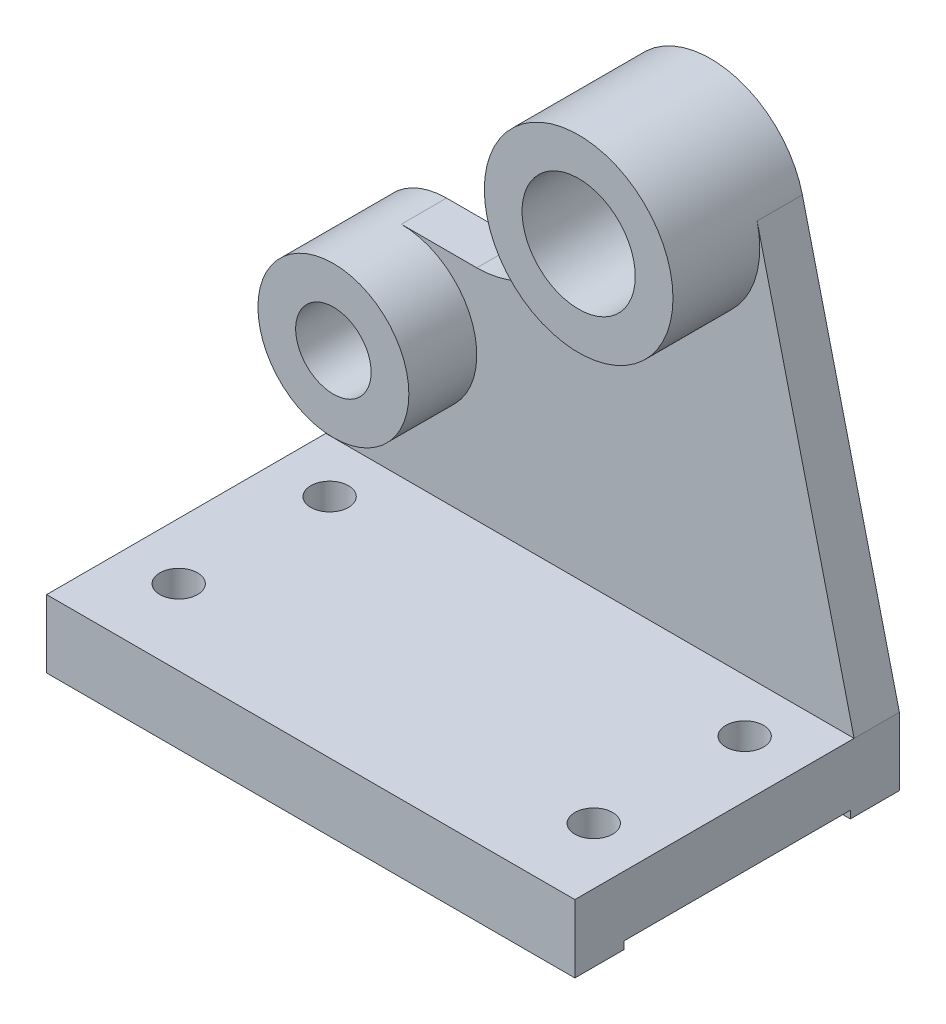
ISO-10303-21;
HEADER;
FILE_DESCRIPTION(('STEP AP214'),'2;1');
FILE_NAME('part.step','',(''),(''),'','','');
FILE_SCHEMA(('AUTOMOTIVE_DESIGN { 1 0 10303 214 1 1 1 1 }'));
ENDSEC;
DATA;
#1=APPLICATION_CONTEXT('core data for automotive mechanical design processes');
#2=APPLICATION_PROTOCOL_DEFINITION('international standard','automotive_design',2000,#1);
#3=PRODUCT_CONTEXT('',#1,'mechanical');
#4=PRODUCT('Part','Part','',(#3));
#5=PRODUCT_RELATED_PRODUCT_CATEGORY('part','',(#4));
#6=PRODUCT_DEFINITION_FORMATION('','',#4);
#7=PRODUCT_DEFINITION_CONTEXT('part definition',#1,'design');
#8=PRODUCT_DEFINITION('design','',#6,#7);
#9=PRODUCT_DEFINITION_SHAPE('','',#8);
#10=(LENGTH_UNIT() NAMED_UNIT(*) SI_UNIT(.MILLI.,.METRE.));
#11=(NAMED_UNIT(*) PLANE_ANGLE_UNIT() SI_UNIT($,.RADIAN.));
#12=(NAMED_UNIT(*) SI_UNIT($,.STERADIAN.) SOLID_ANGLE_UNIT());
#13=UNCERTAINTY_MEASURE_WITH_UNIT(LENGTH_MEASURE(1.E-05),#10,'distance_accuracy_value','');
#14=(GEOMETRIC_REPRESENTATION_CONTEXT(3) GLOBAL_UNCERTAINTY_ASSIGNED_CONTEXT((#13)) GLOBAL_UNIT_ASSIGNED_CONTEXT((#10,
#11,#12)) REPRESENTATION_CONTEXT('',''));
#15=CARTESIAN_POINT('',(0.,0.,0.));
#16=DIRECTION('',(0.,0.,1.));
#17=DIRECTION('',(1.,0.,0.));
#18=AXIS2_PLACEMENT_3D('',#15,#16,#17);
#19=CARTESIAN_POINT('',(0.,-9.,86.));
#20=DIRECTION('',(0.,1.,0.));
#21=DIRECTION('',(0.,0.,1.));
#22=AXIS2_PLACEMENT_3D('',#19,#20,#21);
#23=PLANE('',#22);
#24=DIRECTION('',(0.,0.,-1.));
#25=VECTOR('',#24,1.);
#26=CARTESIAN_POINT('',(-70.,-9.,86.));
#27=LINE('',#26,#25);
#28=CARTESIAN_POINT('',(-70.,-9.,86.));
#29=VERTEX_POINT('',#28);
#30=CARTESIAN_POINT('',(-70.,-9.,73.));
#31=VERTEX_POINT('',#30);
#32=EDGE_CURVE('E271',#29,#31,#27,.T.);
#33=ORIENTED_EDGE('',*,*,#32,.T.);
#34=DIRECTION('',(1.,0.,0.));
#35=VECTOR('',#34,1.);
#36=CARTESIAN_POINT('',(0.,-9.,73.));
#37=LINE('',#36,#35);
#38=CARTESIAN_POINT('',(70.,-9.,73.));
#39=VERTEX_POINT('',#38);
#40=EDGE_CURVE('E11',#31,#39,#37,.T.);
#41=ORIENTED_EDGE('',*,*,#40,.T.);
#42=DIRECTION('',(0.,0.,-1.));
#43=VECTOR('',#42,1.);
#44=CARTESIAN_POINT('',(70.,-9.,86.));
#45=LINE('',#44,#43);
#46=CARTESIAN_POINT('',(70.,-9.,86.));
#47=VERTEX_POINT('',#46);
#48=EDGE_CURVE('E167',#47,#39,#45,.T.);
#49=ORIENTED_EDGE('',*,*,#48,.F.);
#50=DIRECTION('',(1.,0.,0.));
#51=VECTOR('',#50,1.);
#52=CARTESIAN_POINT('',(0.,-9.,86.));
#53=LINE('',#52,#51);
#54=EDGE_CURVE('E255',#29,#47,#53,.T.);
#55=ORIENTED_EDGE('',*,*,#54,.F.);
#56=EDGE_LOOP('',(#33,#41,#49,#55));
#57=FACE_BOUND('',#56,.T.);
#58=ADVANCED_FACE('F39',(#57),#23,.F.);
#59=CARTESIAN_POINT('',(70.,0.,86.));
#60=DIRECTION('',(-1.,0.,0.));
#61=DIRECTION('',(0.,0.,1.));
#62=AXIS2_PLACEMENT_3D('',#59,#60,#61);
#63=PLANE('',#62);
#64=DIRECTION('',(0.,-1.,0.));
#65=VECTOR('',#64,1.);
#66=CARTESIAN_POINT('',(70.,-7.,73.));
#67=LINE('',#66,#65);
#68=CARTESIAN_POINT('',(70.,-7.,73.));
#69=VERTEX_POINT('',#68);
#70=EDGE_CURVE('E172',#69,#39,#67,.T.);
#71=ORIENTED_EDGE('',*,*,#70,.F.);
#72=DIRECTION('',(0.,0.,1.));
#73=VECTOR('',#72,1.);
#74=CARTESIAN_POINT('',(70.,-6.99999999999999,13.));
#75=LINE('',#74,#73);
#76=CARTESIAN_POINT('',(70.,-6.99999999999999,13.));
#77=VERTEX_POINT('',#76);
#78=EDGE_CURVE('E177',#77,#69,#75,.T.);
#79=ORIENTED_EDGE('',*,*,#78,.F.);
#80=DIRECTION('',(0.,1.,0.));
#81=VECTOR('',#80,1.);
#82=CARTESIAN_POINT('',(70.,-6.99999999999999,13.));
#83=LINE('',#82,#81);
#84=CARTESIAN_POINT('',(70.,-9.,13.));
#85=VERTEX_POINT('',#84);
#86=EDGE_CURVE('E151',#85,#77,#83,.T.);
#87=ORIENTED_EDGE('',*,*,#86,.F.);
#88=CARTESIAN_POINT('',(70.,-9.,0.));
#89=VERTEX_POINT('',#88);
#90=EDGE_CURVE('E168',#85,#89,#45,.T.);
#91=ORIENTED_EDGE('',*,*,#90,.T.);
#92=DIRECTION('',(0.,1.,0.));
#93=VECTOR('',#92,1.);
#94=CARTESIAN_POINT('',(70.,0.,0.));
#95=LINE('',#94,#93);
#96=CARTESIAN_POINT('',(70.,9.,0.));
#97=VERTEX_POINT('',#96);
#98=EDGE_CURVE('E268',#89,#97,#95,.T.);
#99=ORIENTED_EDGE('',*,*,#98,.T.);
#100=DIRECTION('',(0.,0.,-1.));
#101=VECTOR('',#100,1.);
#102=CARTESIAN_POINT('',(70.,9.,12.));
#103=LINE('',#102,#101);
#104=CARTESIAN_POINT('',(70.,9.,12.));
#105=VERTEX_POINT('',#104);
#106=EDGE_CURVE('E238',#105,#97,#103,.T.);
#107=ORIENTED_EDGE('',*,*,#106,.F.);
#108=DIRECTION('',(0.,0.,-1.));
#109=VECTOR('',#108,1.);
#110=CARTESIAN_POINT('',(70.,9.,86.));
#111=LINE('',#110,#109);
#112=CARTESIAN_POINT('',(70.,9.,86.));
#113=VERTEX_POINT('',#112);
#114=EDGE_CURVE('E277',#113,#105,#111,.T.);
#115=ORIENTED_EDGE('',*,*,#114,.F.);
#116=DIRECTION('',(0.,1.,0.));
#117=VECTOR('',#116,1.);
#118=CARTESIAN_POINT('',(70.,0.,86.));
#119=LINE('',#118,#117);
#120=EDGE_CURVE('E260',#47,#113,#119,.T.);
#121=ORIENTED_EDGE('',*,*,#120,.F.);
#122=ORIENTED_EDGE('',*,*,#48,.T.);
#123=EDGE_LOOP('',(#71,#79,#87,#91,#99,#107,#115,#121,#122));
#124=FACE_BOUND('',#123,.T.);
#125=ADVANCED_FACE('F307',(#124),#63,.F.);
#126=CARTESIAN_POINT('',(-70.,0.,86.));
#127=DIRECTION('',(-1.,0.,0.));
#128=DIRECTION('',(0.,0.,1.));
#129=AXIS2_PLACEMENT_3D('',#126,#127,#128);
#130=PLANE('',#129);
#131=DIRECTION('',(0.,0.,1.));
#132=VECTOR('',#131,1.);
#133=CARTESIAN_POINT('',(-70.,-6.99999999999999,13.));
#134=LINE('',#133,#132);
#135=CARTESIAN_POINT('',(-70.,-6.99999999999999,13.));
#136=VERTEX_POINT('',#135);
#137=CARTESIAN_POINT('',(-70.,-7.,73.));
#138=VERTEX_POINT('',#137);
#139=EDGE_CURVE('E156',#136,#138,#134,.T.);
#140=ORIENTED_EDGE('',*,*,#139,.T.);
#141=DIRECTION('',(0.,-1.,0.));
#142=VECTOR('',#141,1.);
#143=CARTESIAN_POINT('',(-70.,-7.,73.));
#144=LINE('',#143,#142);
#145=EDGE_CURVE('E57',#138,#31,#144,.T.);
#146=ORIENTED_EDGE('',*,*,#145,.T.);
#147=ORIENTED_EDGE('',*,*,#32,.F.);
#148=DIRECTION('',(0.,1.,0.));
#149=VECTOR('',#148,1.);
#150=CARTESIAN_POINT('',(-70.,0.,86.));
#151=LINE('',#150,#149);
#152=CARTESIAN_POINT('',(-70.,9.,86.));
#153=VERTEX_POINT('',#152);
#154=EDGE_CURVE('E263',#29,#153,#151,.T.);
#155=ORIENTED_EDGE('',*,*,#154,.T.);
#156=DIRECTION('',(0.,0.,-1.));
#157=VECTOR('',#156,1.);
#158=CARTESIAN_POINT('',(-70.,9.,86.));
#159=LINE('',#158,#157);
#160=CARTESIAN_POINT('',(-70.,9.,12.));
#161=VERTEX_POINT('',#160);
#162=EDGE_CURVE('E273',#153,#161,#159,.T.);
#163=ORIENTED_EDGE('',*,*,#162,.T.);
#164=DIRECTION('',(0.,1.,0.));
#165=VECTOR('',#164,1.);
#166=CARTESIAN_POINT('',(-70.,0.,12.));
#167=LINE('',#166,#165);
#168=CARTESIAN_POINT('',(-70.,47.,12.));
#169=VERTEX_POINT('',#168);
#170=EDGE_CURVE('E216',#161,#169,#167,.T.);
#171=ORIENTED_EDGE('',*,*,#170,.T.);
#172=DIRECTION('',(0.,0.,-1.));
#173=VECTOR('',#172,1.);
#174=CARTESIAN_POINT('',(-70.,47.,12.));
#175=LINE('',#174,#173);
#176=CARTESIAN_POINT('',(-70.,47.,0.));
#177=VERTEX_POINT('',#176);
#178=EDGE_CURVE('E245',#169,#177,#175,.T.);
#179=ORIENTED_EDGE('',*,*,#178,.T.);
#180=DIRECTION('',(0.,1.,0.));
#181=VECTOR('',#180,1.);
#182=CARTESIAN_POINT('',(-70.,0.,0.));
#183=LINE('',#182,#181);
#184=CARTESIAN_POINT('',(-70.,-9.,0.));
#185=VERTEX_POINT('',#184);
#186=EDGE_CURVE('E256',#185,#177,#183,.T.);
#187=ORIENTED_EDGE('',*,*,#186,.F.);
#188=CARTESIAN_POINT('',(-70.,-9.,13.));
#189=VERTEX_POINT('',#188);
#190=EDGE_CURVE('E164',#189,#185,#27,.T.);
#191=ORIENTED_EDGE('',*,*,#190,.F.);
#192=DIRECTION('',(0.,1.,0.));
#193=VECTOR('',#192,1.);
#194=CARTESIAN_POINT('',(-70.,-6.99999999999999,13.));
#195=LINE('',#194,#193);
#196=EDGE_CURVE('E146',#189,#136,#195,.T.);
#197=ORIENTED_EDGE('',*,*,#196,.T.);
#198=EDGE_LOOP('',(#140,#146,#147,#155,#163,#171,#179,#187,#191,#197));
#199=FACE_BOUND('',#198,.T.);
#200=ADVANCED_FACE('F162',(#199),#130,.T.);
#201=ORIENTED_EDGE('',*,*,#90,.F.);
#202=DIRECTION('',(-1.,0.,0.));
#203=VECTOR('',#202,1.);
#204=CARTESIAN_POINT('',(0.,-9.,13.));
#205=LINE('',#204,#203);
#206=EDGE_CURVE('E48',#85,#189,#205,.T.);
#207=ORIENTED_EDGE('',*,*,#206,.T.);
#208=ORIENTED_EDGE('',*,*,#190,.T.);
#209=DIRECTION('',(1.,0.,0.));
#210=VECTOR('',#209,1.);
#211=CARTESIAN_POINT('',(0.,-9.,0.));
#212=LINE('',#211,#210);
#213=EDGE_CURVE('E251',#185,#89,#212,.T.);
#214=ORIENTED_EDGE('',*,*,#213,.T.);
#215=EDGE_LOOP('',(#201,#207,#208,#214));
#216=FACE_BOUND('',#215,.T.);
#217=ADVANCED_FACE('F41',(#216),#23,.F.);
#218=CARTESIAN_POINT('',(0.,9.,86.));
#219=DIRECTION('',(0.,1.,0.));
#220=DIRECTION('',(0.,0.,1.));
#221=AXIS2_PLACEMENT_3D('',#218,#219,#220);
#222=PLANE('',#221);
#223=CARTESIAN_POINT('',(-55.0000000000002,9.,26.));
#224=DIRECTION('',(0.,1.,0.));
#225=DIRECTION('',(0.,0.,1.));
#226=AXIS2_PLACEMENT_3D('',#223,#224,#225);
#227=CIRCLE('',#226,5.);
#228=CARTESIAN_POINT('',(-55.0000000000002,9.,31.));
#229=VERTEX_POINT('',#228);
#230=EDGE_CURVE('E522',#229,#229,#227,.T.);
#231=ORIENTED_EDGE('',*,*,#230,.F.);
#232=EDGE_LOOP('',(#231));
#233=FACE_BOUND('',#232,.T.);
#234=CARTESIAN_POINT('',(54.9999999999998,9.,26.));
#235=DIRECTION('',(0.,1.,0.));
#236=DIRECTION('',(0.,0.,1.));
#237=AXIS2_PLACEMENT_3D('',#234,#235,#236);
#238=CIRCLE('',#237,5.);
#239=CARTESIAN_POINT('',(54.9999999999998,9.,31.));
#240=VERTEX_POINT('',#239);
#241=EDGE_CURVE('E516',#240,#240,#238,.T.);
#242=ORIENTED_EDGE('',*,*,#241,.F.);
#243=EDGE_LOOP('',(#242));
#244=FACE_BOUND('',#243,.T.);
#245=CARTESIAN_POINT('',(55.,9.,66.));
#246=DIRECTION('',(0.,1.,0.));
#247=DIRECTION('',(0.,0.,1.));
#248=AXIS2_PLACEMENT_3D('',#245,#246,#247);
#249=CIRCLE('',#248,5.);
#250=CARTESIAN_POINT('',(55.,9.,71.));
#251=VERTEX_POINT('',#250);
#252=EDGE_CURVE('E508',#251,#251,#249,.T.);
#253=ORIENTED_EDGE('',*,*,#252,.F.);
#254=EDGE_LOOP('',(#253));
#255=FACE_BOUND('',#254,.T.);
#256=CARTESIAN_POINT('',(-55.,9.,66.));
#257=DIRECTION('',(0.,1.,0.));
#258=DIRECTION('',(0.,0.,1.));
#259=AXIS2_PLACEMENT_3D('',#256,#257,#258);
#260=CIRCLE('',#259,5.);
#261=CARTESIAN_POINT('',(-55.,9.,71.));
#262=VERTEX_POINT('',#261);
#263=EDGE_CURVE('E285',#262,#262,#260,.T.);
#264=ORIENTED_EDGE('',*,*,#263,.F.);
#265=EDGE_LOOP('',(#264));
#266=FACE_BOUND('',#265,.T.);
#267=DIRECTION('',(1.,0.,0.));
#268=VECTOR('',#267,1.);
#269=CARTESIAN_POINT('',(0.,9.,12.));
#270=LINE('',#269,#268);
#271=EDGE_CURVE('E63',#161,#105,#270,.T.);
#272=ORIENTED_EDGE('',*,*,#271,.F.);
#273=ORIENTED_EDGE('',*,*,#162,.F.);
#274=DIRECTION('',(1.,0.,0.));
#275=VECTOR('',#274,1.);
#276=CARTESIAN_POINT('',(0.,9.,86.));
#277=LINE('',#276,#275);
#278=EDGE_CURVE('E257',#153,#113,#277,.T.);
#279=ORIENTED_EDGE('',*,*,#278,.T.);
#280=ORIENTED_EDGE('',*,*,#114,.T.);
#281=EDGE_LOOP('',(#272,#273,#279,#280));
#282=FACE_BOUND('',#281,.T.);
#283=ADVANCED_FACE('F312',(#233,#244,#255,#266,#282),#222,.T.);
#284=CARTESIAN_POINT('',(0.,0.,86.));
#285=DIRECTION('',(0.,0.,1.));
#286=DIRECTION('',(1.,0.,0.));
#287=AXIS2_PLACEMENT_3D('',#284,#285,#286);
#288=PLANE('',#287);
#289=ORIENTED_EDGE('',*,*,#54,.T.);
#290=ORIENTED_EDGE('',*,*,#120,.T.);
#291=ORIENTED_EDGE('',*,*,#278,.F.);
#292=ORIENTED_EDGE('',*,*,#154,.F.);
#293=EDGE_LOOP('',(#289,#290,#291,#292));
#294=FACE_BOUND('',#293,.T.);
#295=ADVANCED_FACE('F325',(#294),#288,.T.);
#296=CARTESIAN_POINT('',(0.,0.,0.));
#297=DIRECTION('',(0.,0.,1.));
#298=DIRECTION('',(1.,0.,0.));
#299=AXIS2_PLACEMENT_3D('',#296,#297,#298);
#300=PLANE('',#299);
#301=ORIENTED_EDGE('',*,*,#213,.F.);
#302=ORIENTED_EDGE('',*,*,#186,.T.);
#303=CARTESIAN_POINT('',(-50.,47.,0.));
#304=DIRECTION('',(0.,0.,1.));
#305=DIRECTION('',(1.,0.,0.));
#306=AXIS2_PLACEMENT_3D('',#303,#304,#305);
#307=CIRCLE('',#306,20.);
#308=CARTESIAN_POINT('',(-50.,67.,0.));
#309=VERTEX_POINT('',#308);
#310=EDGE_CURVE('E183',#309,#177,#307,.T.);
#311=ORIENTED_EDGE('',*,*,#310,.F.);
#312=DIRECTION('',(1.,0.,0.));
#313=VECTOR('',#312,1.);
#314=CARTESIAN_POINT('',(0.,67.,0.));
#315=LINE('',#314,#313);
#316=CARTESIAN_POINT('',(-30.0000000000002,67.,0.));
#317=VERTEX_POINT('',#316);
#318=EDGE_CURVE('E235',#309,#317,#315,.T.);
#319=ORIENTED_EDGE('',*,*,#318,.T.);
#320=CARTESIAN_POINT('',(-30.,92.,0.));
#321=DIRECTION('',(0.,0.,1.));
#322=DIRECTION('',(1.,0.,0.));
#323=AXIS2_PLACEMENT_3D('',#320,#321,#322);
#324=CIRCLE('',#323,25.);
#325=CARTESIAN_POINT('',(-5.00000000000001,92.0000000000002,0.));
#326=VERTEX_POINT('',#325);
#327=EDGE_CURVE('E228',#326,#317,#324,.F.);
#328=ORIENTED_EDGE('',*,*,#327,.F.);
#329=DIRECTION('',(0.,1.,0.));
#330=VECTOR('',#329,1.);
#331=CARTESIAN_POINT('',(-5.00000000000001,0.,0.));
#332=LINE('',#331,#330);
#333=CARTESIAN_POINT('',(-5.00000000000001,109.,0.));
#334=VERTEX_POINT('',#333);
#335=EDGE_CURVE('E199',#326,#334,#332,.T.);
#336=ORIENTED_EDGE('',*,*,#335,.T.);
#337=CARTESIAN_POINT('',(20.,109.,0.));
#338=DIRECTION('',(0.,0.,1.));
#339=DIRECTION('',(1.,0.,0.));
#340=AXIS2_PLACEMENT_3D('',#337,#338,#339);
#341=CIRCLE('',#340,25.);
#342=CARTESIAN_POINT('',(44.2944947177034,114.897247358852,0.));
#343=VERTEX_POINT('',#342);
#344=EDGE_CURVE('E197',#343,#334,#341,.T.);
#345=ORIENTED_EDGE('',*,*,#344,.F.);
#346=DIRECTION('',(-0.235889894354067,0.971779788708135,0.));
#347=VECTOR('',#346,1.);
#348=CARTESIAN_POINT('',(68.1680143271579,16.5471085988899,0.));
#349=LINE('',#348,#347);
#350=EDGE_CURVE('E208',#97,#343,#349,.T.);
#351=ORIENTED_EDGE('',*,*,#350,.F.);
#352=ORIENTED_EDGE('',*,*,#98,.F.);
#353=EDGE_LOOP('',(#301,#302,#311,#319,#328,#336,#345,#351,#352));
#354=FACE_BOUND('',#353,.T.);
#355=CARTESIAN_POINT('',(20.,109.,0.));
#356=DIRECTION('',(0.,0.,1.));
#357=DIRECTION('',(1.,0.,0.));
#358=AXIS2_PLACEMENT_3D('',#355,#356,#357);
#359=CIRCLE('',#358,15.);
#360=CARTESIAN_POINT('',(35.,109.,0.));
#361=VERTEX_POINT('',#360);
#362=EDGE_CURVE('E190',#361,#361,#359,.T.);
#363=ORIENTED_EDGE('',*,*,#362,.T.);
#364=EDGE_LOOP('',(#363));
#365=FACE_BOUND('',#364,.T.);
#366=CARTESIAN_POINT('',(-50.,47.,0.));
#367=DIRECTION('',(0.,0.,1.));
#368=DIRECTION('',(1.,0.,0.));
#369=AXIS2_PLACEMENT_3D('',#366,#367,#368);
#370=CIRCLE('',#369,10.);
#371=CARTESIAN_POINT('',(-40.,47.,0.));
#372=VERTEX_POINT('',#371);
#373=EDGE_CURVE('E176',#372,#372,#370,.T.);
#374=ORIENTED_EDGE('',*,*,#373,.T.);
#375=EDGE_LOOP('',(#374));
#376=FACE_BOUND('',#375,.T.);
#377=ADVANCED_FACE('F334',(#354,#365,#376),#300,.F.);
#378=CARTESIAN_POINT('',(-5.00000000000001,0.,12.));
#379=DIRECTION('',(-1.,0.,0.));
#380=DIRECTION('',(0.,0.,1.));
#381=AXIS2_PLACEMENT_3D('',#378,#379,#380);
#382=PLANE('',#381);
#383=ORIENTED_EDGE('',*,*,#335,.F.);
#384=DIRECTION('',(0.,0.,-1.));
#385=VECTOR('',#384,1.);
#386=CARTESIAN_POINT('',(-5.00000000000001,92.0000000000002,12.));
#387=LINE('',#386,#385);
#388=CARTESIAN_POINT('',(-5.00000000000001,92.0000000000002,12.));
#389=VERTEX_POINT('',#388);
#390=EDGE_CURVE('E253',#389,#326,#387,.T.);
#391=ORIENTED_EDGE('',*,*,#390,.F.);
#392=DIRECTION('',(0.,1.,0.));
#393=VECTOR('',#392,1.);
#394=CARTESIAN_POINT('',(-5.00000000000001,0.,12.));
#395=LINE('',#394,#393);
#396=CARTESIAN_POINT('',(-5.00000000000001,109.,12.));
#397=VERTEX_POINT('',#396);
#398=EDGE_CURVE('E202',#389,#397,#395,.T.);
#399=ORIENTED_EDGE('',*,*,#398,.T.);
#400=DIRECTION('',(0.,0.,-1.));
#401=VECTOR('',#400,1.);
#402=CARTESIAN_POINT('',(-5.00000000000001,109.,12.));
#403=LINE('',#402,#401);
#404=EDGE_CURVE('E229',#397,#334,#403,.T.);
#405=ORIENTED_EDGE('',*,*,#404,.T.);
#406=EDGE_LOOP('',(#383,#391,#399,#405));
#407=FACE_BOUND('',#406,.T.);
#408=ADVANCED_FACE('F361',(#407),#382,.T.);
#409=CARTESIAN_POINT('',(-30.,92.,12.));
#410=DIRECTION('',(0.,0.,-1.));
#411=DIRECTION('',(-1.,0.,0.));
#412=AXIS2_PLACEMENT_3D('',#409,#410,#411);
#413=CYLINDRICAL_SURFACE('',#412,25.);
#414=ORIENTED_EDGE('',*,*,#327,.T.);
#415=DIRECTION('',(0.,0.,-1.));
#416=VECTOR('',#415,1.);
#417=CARTESIAN_POINT('',(-30.0000000000002,67.,12.));
#418=LINE('',#417,#416);
#419=CARTESIAN_POINT('',(-30.0000000000002,67.,12.));
#420=VERTEX_POINT('',#419);
#421=EDGE_CURVE('E246',#420,#317,#418,.T.);
#422=ORIENTED_EDGE('',*,*,#421,.F.);
#423=CARTESIAN_POINT('',(-30.,92.,12.));
#424=DIRECTION('',(0.,0.,1.));
#425=DIRECTION('',(1.,0.,0.));
#426=AXIS2_PLACEMENT_3D('',#423,#424,#425);
#427=CIRCLE('',#426,25.);
#428=EDGE_CURVE('E210',#389,#420,#427,.F.);
#429=ORIENTED_EDGE('',*,*,#428,.F.);
#430=ORIENTED_EDGE('',*,*,#390,.T.);
#431=EDGE_LOOP('',(#414,#422,#429,#430));
#432=FACE_BOUND('',#431,.T.);
#433=ADVANCED_FACE('F363',(#432),#413,.F.);
#434=CARTESIAN_POINT('',(0.,67.,12.));
#435=DIRECTION('',(0.,1.,0.));
#436=DIRECTION('',(0.,0.,1.));
#437=AXIS2_PLACEMENT_3D('',#434,#435,#436);
#438=PLANE('',#437);
#439=ORIENTED_EDGE('',*,*,#318,.F.);
#440=DIRECTION('',(0.,0.,-1.));
#441=VECTOR('',#440,1.);
#442=CARTESIAN_POINT('',(-50.,67.,12.));
#443=LINE('',#442,#441);
#444=CARTESIAN_POINT('',(-50.,67.,12.));
#445=VERTEX_POINT('',#444);
#446=EDGE_CURVE('E247',#445,#309,#443,.T.);
#447=ORIENTED_EDGE('',*,*,#446,.F.);
#448=DIRECTION('',(1.,0.,0.));
#449=VECTOR('',#448,1.);
#450=CARTESIAN_POINT('',(0.,67.,12.));
#451=LINE('',#450,#449);
#452=EDGE_CURVE('E209',#445,#420,#451,.T.);
#453=ORIENTED_EDGE('',*,*,#452,.T.);
#454=ORIENTED_EDGE('',*,*,#421,.T.);
#455=EDGE_LOOP('',(#439,#447,#453,#454));
#456=FACE_BOUND('',#455,.T.);
#457=ADVANCED_FACE('F360',(#456),#438,.T.);
#458=CARTESIAN_POINT('',(68.1680143271579,16.5471085988899,12.));
#459=DIRECTION('',(-0.971779788708135,-0.235889894354067,0.));
#460=DIRECTION('',(0.235889894354067,-0.971779788708135,0.));
#461=AXIS2_PLACEMENT_3D('',#458,#459,#460);
#462=PLANE('',#461);
#463=ORIENTED_EDGE('',*,*,#350,.T.);
#464=DIRECTION('',(0.,0.,-1.));
#465=VECTOR('',#464,1.);
#466=CARTESIAN_POINT('',(44.2944947177034,114.897247358852,12.));
#467=LINE('',#466,#465);
#468=CARTESIAN_POINT('',(44.2944947177034,114.897247358852,12.));
#469=VERTEX_POINT('',#468);
#470=EDGE_CURVE('E240',#469,#343,#467,.T.);
#471=ORIENTED_EDGE('',*,*,#470,.F.);
#472=DIRECTION('',(-0.235889894354067,0.971779788708135,0.));
#473=VECTOR('',#472,1.);
#474=CARTESIAN_POINT('',(68.1680143271579,16.5471085988899,12.));
#475=LINE('',#474,#473);
#476=EDGE_CURVE('E219',#105,#469,#475,.T.);
#477=ORIENTED_EDGE('',*,*,#476,.F.);
#478=ORIENTED_EDGE('',*,*,#106,.T.);
#479=EDGE_LOOP('',(#463,#471,#477,#478));
#480=FACE_BOUND('',#479,.T.);
#481=ADVANCED_FACE('F336',(#480),#462,.F.);
#482=CARTESIAN_POINT('',(0.,0.,12.));
#483=DIRECTION('',(0.,0.,1.));
#484=DIRECTION('',(1.,0.,0.));
#485=AXIS2_PLACEMENT_3D('',#482,#483,#484);
#486=PLANE('',#485);
#487=ORIENTED_EDGE('',*,*,#398,.F.);
#488=ORIENTED_EDGE('',*,*,#428,.T.);
#489=ORIENTED_EDGE('',*,*,#452,.F.);
#490=CARTESIAN_POINT('',(-50.,47.,12.));
#491=DIRECTION('',(0.,0.,1.));
#492=DIRECTION('',(1.,0.,0.));
#493=AXIS2_PLACEMENT_3D('',#490,#491,#492);
#494=CIRCLE('',#493,20.);
#495=EDGE_CURVE('E213',#169,#445,#494,.T.);
#496=ORIENTED_EDGE('',*,*,#495,.F.);
#497=ORIENTED_EDGE('',*,*,#170,.F.);
#498=ORIENTED_EDGE('',*,*,#271,.T.);
#499=ORIENTED_EDGE('',*,*,#476,.T.);
#500=CARTESIAN_POINT('',(20.,109.,12.));
#501=DIRECTION('',(0.,0.,1.));
#502=DIRECTION('',(1.,0.,0.));
#503=AXIS2_PLACEMENT_3D('',#500,#501,#502);
#504=CIRCLE('',#503,25.);
#505=EDGE_CURVE('E224',#397,#469,#504,.T.);
#506=ORIENTED_EDGE('',*,*,#505,.F.);
#507=EDGE_LOOP('',(#487,#488,#489,#496,#497,#498,#499,#506));
#508=FACE_BOUND('',#507,.T.);
#509=ADVANCED_FACE('F347',(#508),#486,.T.);
#510=CARTESIAN_POINT('',(20.,109.,35.));
#511=DIRECTION('',(0.,0.,-1.));
#512=DIRECTION('',(-1.,0.,0.));
#513=AXIS2_PLACEMENT_3D('',#510,#511,#512);
#514=CYLINDRICAL_SURFACE('',#513,15.);
#515=CARTESIAN_POINT('',(20.,109.,35.));
#516=DIRECTION('',(0.,0.,1.));
#517=DIRECTION('',(1.,0.,0.));
#518=AXIS2_PLACEMENT_3D('',#515,#516,#517);
#519=CIRCLE('',#518,15.);
#520=CARTESIAN_POINT('',(35.,109.,35.));
#521=VERTEX_POINT('',#520);
#522=EDGE_CURVE('E194',#521,#521,#519,.T.);
#523=ORIENTED_EDGE('',*,*,#522,.T.);
#524=EDGE_LOOP('',(#523));
#525=FACE_BOUND('',#524,.T.);
#526=ORIENTED_EDGE('',*,*,#362,.F.);
#527=EDGE_LOOP('',(#526));
#528=FACE_BOUND('',#527,.T.);
#529=ADVANCED_FACE('F406',(#525,#528),#514,.F.);
#530=CARTESIAN_POINT('',(20.,109.,35.));
#531=DIRECTION('',(0.,0.,-1.));
#532=DIRECTION('',(-1.,0.,0.));
#533=AXIS2_PLACEMENT_3D('',#530,#531,#532);
#534=CYLINDRICAL_SURFACE('',#533,25.);
#535=ORIENTED_EDGE('',*,*,#404,.F.);
#536=ORIENTED_EDGE('',*,*,#505,.T.);
#537=ORIENTED_EDGE('',*,*,#470,.T.);
#538=ORIENTED_EDGE('',*,*,#344,.T.);
#539=EDGE_LOOP('',(#535,#536,#537,#538));
#540=FACE_BOUND('',#539,.T.);
#541=CARTESIAN_POINT('',(20.,109.,35.));
#542=DIRECTION('',(0.,0.,1.));
#543=DIRECTION('',(1.,0.,0.));
#544=AXIS2_PLACEMENT_3D('',#541,#542,#543);
#545=CIRCLE('',#544,25.);
#546=CARTESIAN_POINT('',(45.,109.,35.));
#547=VERTEX_POINT('',#546);
#548=EDGE_CURVE('E198',#547,#547,#545,.T.);
#549=ORIENTED_EDGE('',*,*,#548,.F.);
#550=EDGE_LOOP('',(#549));
#551=FACE_BOUND('',#550,.T.);
#552=ADVANCED_FACE('F342',(#540,#551),#534,.T.);
#553=CARTESIAN_POINT('',(0.,0.,35.));
#554=DIRECTION('',(0.,0.,1.));
#555=DIRECTION('',(1.,0.,0.));
#556=AXIS2_PLACEMENT_3D('',#553,#554,#555);
#557=PLANE('',#556);
#558=ORIENTED_EDGE('',*,*,#522,.F.);
#559=EDGE_LOOP('',(#558));
#560=FACE_BOUND('',#559,.T.);
#561=ORIENTED_EDGE('',*,*,#548,.T.);
#562=EDGE_LOOP('',(#561));
#563=FACE_BOUND('',#562,.T.);
#564=ADVANCED_FACE('F398',(#560,#563),#557,.T.);
#565=CARTESIAN_POINT('',(-50.,47.,30.));
#566=DIRECTION('',(0.,0.,-1.));
#567=DIRECTION('',(-1.,0.,0.));
#568=AXIS2_PLACEMENT_3D('',#565,#566,#567);
#569=CYLINDRICAL_SURFACE('',#568,10.);
#570=CARTESIAN_POINT('',(-50.,47.,30.));
#571=DIRECTION('',(0.,0.,1.));
#572=DIRECTION('',(1.,0.,0.));
#573=AXIS2_PLACEMENT_3D('',#570,#571,#572);
#574=CIRCLE('',#573,10.);
#575=CARTESIAN_POINT('',(-40.,47.,30.));
#576=VERTEX_POINT('',#575);
#577=EDGE_CURVE('E182',#576,#576,#574,.T.);
#578=ORIENTED_EDGE('',*,*,#577,.T.);
#579=EDGE_LOOP('',(#578));
#580=FACE_BOUND('',#579,.T.);
#581=ORIENTED_EDGE('',*,*,#373,.F.);
#582=EDGE_LOOP('',(#581));
#583=FACE_BOUND('',#582,.T.);
#584=ADVANCED_FACE('F400',(#580,#583),#569,.F.);
#585=CARTESIAN_POINT('',(-50.,47.,30.));
#586=DIRECTION('',(0.,0.,-1.));
#587=DIRECTION('',(-1.,0.,0.));
#588=AXIS2_PLACEMENT_3D('',#585,#586,#587);
#589=CYLINDRICAL_SURFACE('',#588,20.);
#590=ORIENTED_EDGE('',*,*,#178,.F.);
#591=ORIENTED_EDGE('',*,*,#495,.T.);
#592=ORIENTED_EDGE('',*,*,#446,.T.);
#593=ORIENTED_EDGE('',*,*,#310,.T.);
#594=EDGE_LOOP('',(#590,#591,#592,#593));
#595=FACE_BOUND('',#594,.T.);
#596=CARTESIAN_POINT('',(-50.,47.,30.));
#597=DIRECTION('',(0.,0.,1.));
#598=DIRECTION('',(1.,0.,0.));
#599=AXIS2_PLACEMENT_3D('',#596,#597,#598);
#600=CIRCLE('',#599,20.);
#601=CARTESIAN_POINT('',(-30.,47.,30.));
#602=VERTEX_POINT('',#601);
#603=EDGE_CURVE('E184',#602,#602,#600,.T.);
#604=ORIENTED_EDGE('',*,*,#603,.F.);
#605=EDGE_LOOP('',(#604));
#606=FACE_BOUND('',#605,.T.);
#607=ADVANCED_FACE('F348',(#595,#606),#589,.T.);
#608=CARTESIAN_POINT('',(0.,0.,30.));
#609=DIRECTION('',(0.,0.,1.));
#610=DIRECTION('',(1.,0.,0.));
#611=AXIS2_PLACEMENT_3D('',#608,#609,#610);
#612=PLANE('',#611);
#613=ORIENTED_EDGE('',*,*,#577,.F.);
#614=EDGE_LOOP('',(#613));
#615=FACE_BOUND('',#614,.T.);
#616=ORIENTED_EDGE('',*,*,#603,.T.);
#617=EDGE_LOOP('',(#616));
#618=FACE_BOUND('',#617,.T.);
#619=ADVANCED_FACE('F384',(#615,#618),#612,.T.);
#620=CARTESIAN_POINT('',(-70.,-7.,73.));
#621=DIRECTION('',(0.,0.,1.));
#622=DIRECTION('',(0.,-1.,0.));
#623=AXIS2_PLACEMENT_3D('',#620,#621,#622);
#624=PLANE('',#623);
#625=ORIENTED_EDGE('',*,*,#145,.F.);
#626=DIRECTION('',(1.,0.,0.));
#627=VECTOR('',#626,1.);
#628=CARTESIAN_POINT('',(-70.,-7.,73.));
#629=LINE('',#628,#627);
#630=EDGE_CURVE('E154',#138,#69,#629,.T.);
#631=ORIENTED_EDGE('',*,*,#630,.T.);
#632=ORIENTED_EDGE('',*,*,#70,.T.);
#633=ORIENTED_EDGE('',*,*,#40,.F.);
#634=EDGE_LOOP('',(#625,#631,#632,#633));
#635=FACE_BOUND('',#634,.T.);
#636=ADVANCED_FACE('F383',(#635),#624,.F.);
#637=CARTESIAN_POINT('',(-70.,-6.99999999999999,13.));
#638=DIRECTION('',(0.,0.,-1.));
#639=DIRECTION('',(0.,1.,0.));
#640=AXIS2_PLACEMENT_3D('',#637,#638,#639);
#641=PLANE('',#640);
#642=ORIENTED_EDGE('',*,*,#86,.T.);
#643=DIRECTION('',(1.,0.,0.));
#644=VECTOR('',#643,1.);
#645=CARTESIAN_POINT('',(-70.,-6.99999999999999,13.));
#646=LINE('',#645,#644);
#647=EDGE_CURVE('E145',#136,#77,#646,.T.);
#648=ORIENTED_EDGE('',*,*,#647,.F.);
#649=ORIENTED_EDGE('',*,*,#196,.F.);
#650=ORIENTED_EDGE('',*,*,#206,.F.);
#651=EDGE_LOOP('',(#642,#648,#649,#650));
#652=FACE_BOUND('',#651,.T.);
#653=ADVANCED_FACE('F148',(#652),#641,.F.);
#654=CARTESIAN_POINT('',(-70.,-6.99999999999999,13.));
#655=DIRECTION('',(0.,1.,0.));
#656=DIRECTION('',(0.,0.,1.));
#657=AXIS2_PLACEMENT_3D('',#654,#655,#656);
#658=PLANE('',#657);
#659=CARTESIAN_POINT('',(-55.0000000000002,-6.99999999999999,26.));
#660=DIRECTION('',(0.,1.,0.));
#661=DIRECTION('',(0.,0.,1.));
#662=AXIS2_PLACEMENT_3D('',#659,#660,#661);
#663=CIRCLE('',#662,5.);
#664=CARTESIAN_POINT('',(-55.0000000000002,-6.99999999999999,31.));
#665=VERTEX_POINT('',#664);
#666=EDGE_CURVE('E43',#665,#665,#663,.T.);
#667=ORIENTED_EDGE('',*,*,#666,.T.);
#668=EDGE_LOOP('',(#667));
#669=FACE_BOUND('',#668,.T.);
#670=CARTESIAN_POINT('',(54.9999999999998,-6.99999999999999,26.));
#671=DIRECTION('',(0.,1.,0.));
#672=DIRECTION('',(0.,0.,1.));
#673=AXIS2_PLACEMENT_3D('',#670,#671,#672);
#674=CIRCLE('',#673,5.);
#675=CARTESIAN_POINT('',(54.9999999999998,-6.99999999999999,31.));
#676=VERTEX_POINT('',#675);
#677=EDGE_CURVE('E282',#676,#676,#674,.T.);
#678=ORIENTED_EDGE('',*,*,#677,.T.);
#679=EDGE_LOOP('',(#678));
#680=FACE_BOUND('',#679,.T.);
#681=CARTESIAN_POINT('',(55.,-6.99999999999999,66.));
#682=DIRECTION('',(0.,1.,0.));
#683=DIRECTION('',(0.,0.,1.));
#684=AXIS2_PLACEMENT_3D('',#681,#682,#683);
#685=CIRCLE('',#684,5.);
#686=CARTESIAN_POINT('',(55.,-6.99999999999999,71.));
#687=VERTEX_POINT('',#686);
#688=EDGE_CURVE('E281',#687,#687,#685,.T.);
#689=ORIENTED_EDGE('',*,*,#688,.T.);
#690=EDGE_LOOP('',(#689));
#691=FACE_BOUND('',#690,.T.);
#692=CARTESIAN_POINT('',(-55.,-6.99999999999999,66.));
#693=DIRECTION('',(0.,1.,0.));
#694=DIRECTION('',(0.,0.,1.));
#695=AXIS2_PLACEMENT_3D('',#692,#693,#694);
#696=CIRCLE('',#695,5.);
#697=CARTESIAN_POINT('',(-55.,-6.99999999999999,71.));
#698=VERTEX_POINT('',#697);
#699=EDGE_CURVE('E276',#698,#698,#696,.T.);
#700=ORIENTED_EDGE('',*,*,#699,.T.);
#701=EDGE_LOOP('',(#700));
#702=FACE_BOUND('',#701,.T.);
#703=ORIENTED_EDGE('',*,*,#78,.T.);
#704=ORIENTED_EDGE('',*,*,#630,.F.);
#705=ORIENTED_EDGE('',*,*,#139,.F.);
#706=ORIENTED_EDGE('',*,*,#647,.T.);
#707=EDGE_LOOP('',(#703,#704,#705,#706));
#708=FACE_BOUND('',#707,.T.);
#709=ADVANCED_FACE('F157',(#669,#680,#691,#702,#708),#658,.F.);
#710=CARTESIAN_POINT('',(-55.,-131.,66.));
#711=DIRECTION('',(0.,1.,0.));
#712=DIRECTION('',(0.,0.,1.));
#713=AXIS2_PLACEMENT_3D('',#710,#711,#712);
#714=CYLINDRICAL_SURFACE('',#713,5.);
#715=ORIENTED_EDGE('',*,*,#263,.T.);
#716=EDGE_LOOP('',(#715));
#717=FACE_BOUND('',#716,.T.);
#718=ORIENTED_EDGE('',*,*,#699,.F.);
#719=EDGE_LOOP('',(#718));
#720=FACE_BOUND('',#719,.T.);
#721=ADVANCED_FACE('F476',(#717,#720),#714,.F.);
#722=CARTESIAN_POINT('',(55.,-131.,66.));
#723=DIRECTION('',(0.,1.,0.));
#724=DIRECTION('',(0.,0.,1.));
#725=AXIS2_PLACEMENT_3D('',#722,#723,#724);
#726=CYLINDRICAL_SURFACE('',#725,5.);
#727=ORIENTED_EDGE('',*,*,#252,.T.);
#728=EDGE_LOOP('',(#727));
#729=FACE_BOUND('',#728,.T.);
#730=ORIENTED_EDGE('',*,*,#688,.F.);
#731=EDGE_LOOP('',(#730));
#732=FACE_BOUND('',#731,.T.);
#733=ADVANCED_FACE('F302',(#729,#732),#726,.F.);
#734=CARTESIAN_POINT('',(54.9999999999998,-131.,26.));
#735=DIRECTION('',(0.,1.,0.));
#736=DIRECTION('',(0.,0.,1.));
#737=AXIS2_PLACEMENT_3D('',#734,#735,#736);
#738=CYLINDRICAL_SURFACE('',#737,5.);
#739=ORIENTED_EDGE('',*,*,#241,.T.);
#740=EDGE_LOOP('',(#739));
#741=FACE_BOUND('',#740,.T.);
#742=ORIENTED_EDGE('',*,*,#677,.F.);
#743=EDGE_LOOP('',(#742));
#744=FACE_BOUND('',#743,.T.);
#745=ADVANCED_FACE('F293',(#741,#744),#738,.F.);
#746=CARTESIAN_POINT('',(-55.0000000000002,-131.,26.));
#747=DIRECTION('',(0.,1.,0.));
#748=DIRECTION('',(0.,0.,1.));
#749=AXIS2_PLACEMENT_3D('',#746,#747,#748);
#750=CYLINDRICAL_SURFACE('',#749,5.);
#751=ORIENTED_EDGE('',*,*,#230,.T.);
#752=EDGE_LOOP('',(#751));
#753=FACE_BOUND('',#752,.T.);
#754=ORIENTED_EDGE('',*,*,#666,.F.);
#755=EDGE_LOOP('',(#754));
#756=FACE_BOUND('',#755,.T.);
#757=ADVANCED_FACE('F291',(#753,#756),#750,.F.);
#758=CLOSED_SHELL('',(#58,#125,#200,#217,#283,#295,#377,#408,#433,#457,#481,#509,#529,#552,#564,
#584,#607,#619,#636,#653,#709,#721,#733,#745,#757));
#759=MANIFOLD_SOLID_BREP('B2',#758);
#760=ADVANCED_BREP_SHAPE_REPRESENTATION('',(#18,#759),#14);
#761=SHAPE_DEFINITION_REPRESENTATION(#9,#760);
ENDSEC;
END-ISO-10303-21;
